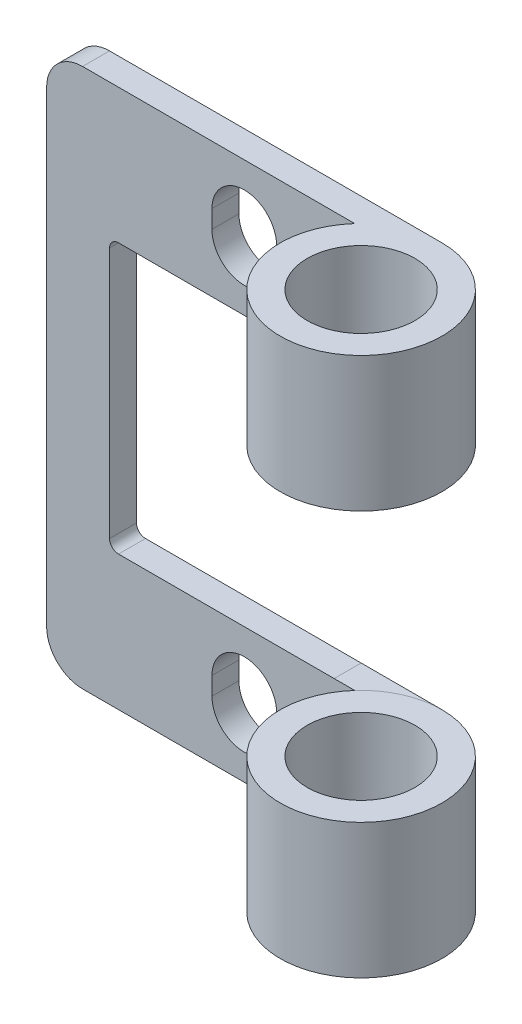
ISO-10303-21;
HEADER;
FILE_DESCRIPTION(('STEP AP214'),'2;1');
FILE_NAME('part.step','',(''),(''),'','','');
FILE_SCHEMA(('AUTOMOTIVE_DESIGN { 1 0 10303 214 1 1 1 1 }'));
ENDSEC;
DATA;
#1=APPLICATION_CONTEXT('core data for automotive mechanical design processes');
#2=APPLICATION_PROTOCOL_DEFINITION('international standard','automotive_design',2000,#1);
#3=PRODUCT_CONTEXT('',#1,'mechanical');
#4=PRODUCT('Part','Part','',(#3));
#5=PRODUCT_RELATED_PRODUCT_CATEGORY('part','',(#4));
#6=PRODUCT_DEFINITION_FORMATION('','',#4);
#7=PRODUCT_DEFINITION_CONTEXT('part definition',#1,'design');
#8=PRODUCT_DEFINITION('design','',#6,#7);
#9=PRODUCT_DEFINITION_SHAPE('','',#8);
#10=(LENGTH_UNIT() NAMED_UNIT(*) SI_UNIT(.MILLI.,.METRE.));
#11=(NAMED_UNIT(*) PLANE_ANGLE_UNIT() SI_UNIT($,.RADIAN.));
#12=(NAMED_UNIT(*) SI_UNIT($,.STERADIAN.) SOLID_ANGLE_UNIT());
#13=UNCERTAINTY_MEASURE_WITH_UNIT(LENGTH_MEASURE(1.E-05),#10,'distance_accuracy_value','');
#14=(GEOMETRIC_REPRESENTATION_CONTEXT(3) GLOBAL_UNCERTAINTY_ASSIGNED_CONTEXT((#13)) GLOBAL_UNIT_ASSIGNED_CONTEXT((#10,
#11,#12)) REPRESENTATION_CONTEXT('',''));
#15=CARTESIAN_POINT('',(0.,0.,0.));
#16=DIRECTION('',(0.,0.,1.));
#17=DIRECTION('',(1.,0.,0.));
#18=AXIS2_PLACEMENT_3D('',#15,#16,#17);
#19=CARTESIAN_POINT('',(20.5,0.,3.));
#20=DIRECTION('',(0.,-1.,0.));
#21=DIRECTION('',(0.,0.,-1.));
#22=AXIS2_PLACEMENT_3D('',#19,#20,#21);
#23=CYLINDRICAL_SURFACE('',#22,4.49999999999999);
#24=DIRECTION('',(0.,1.,0.));
#25=VECTOR('',#24,1.);
#26=CARTESIAN_POINT('',(20.5,-30.,-1.5));
#27=LINE('',#26,#25);
#28=CARTESIAN_POINT('',(20.5,-30.,-1.49999999999999));
#29=VERTEX_POINT('',#28);
#30=CARTESIAN_POINT('',(20.5,-22.5,-1.5));
#31=VERTEX_POINT('',#30);
#32=EDGE_CURVE('E321',#29,#31,#27,.T.);
#33=ORIENTED_EDGE('',*,*,#32,.T.);
#34=CARTESIAN_POINT('',(20.5,-22.5,3.));
#35=DIRECTION('',(0.,1.,0.));
#36=DIRECTION('',(0.,0.,1.));
#37=AXIS2_PLACEMENT_3D('',#34,#35,#36);
#38=CIRCLE('',#37,4.49999999999999);
#39=CARTESIAN_POINT('',(17.1458980337503,-22.5,0.));
#40=VERTEX_POINT('',#39);
#41=EDGE_CURVE('E282',#31,#40,#38,.F.);
#42=ORIENTED_EDGE('',*,*,#41,.T.);
#43=DIRECTION('',(0.,-1.,0.));
#44=VECTOR('',#43,1.);
#45=CARTESIAN_POINT('',(17.1458980337503,0.,0.));
#46=LINE('',#45,#44);
#47=CARTESIAN_POINT('',(17.1458980337503,-30.,0.));
#48=VERTEX_POINT('',#47);
#49=EDGE_CURVE('E317',#40,#48,#46,.T.);
#50=ORIENTED_EDGE('',*,*,#49,.T.);
#51=CARTESIAN_POINT('',(20.5,-30.,3.));
#52=DIRECTION('',(0.,-1.,0.));
#53=DIRECTION('',(1.,0.,0.));
#54=AXIS2_PLACEMENT_3D('',#51,#52,#53);
#55=CIRCLE('',#54,4.49999999999999);
#56=EDGE_CURVE('E306',#29,#48,#55,.T.);
#57=ORIENTED_EDGE('',*,*,#56,.F.);
#58=EDGE_LOOP('',(#33,#42,#50,#57));
#59=FACE_BOUND('',#58,.T.);
#60=ADVANCED_FACE('F43',(#59),#23,.T.);
#61=DIRECTION('',(0.,-1.,0.));
#62=VECTOR('',#61,1.);
#63=CARTESIAN_POINT('',(17.1458980337503,0.,0.));
#64=LINE('',#63,#62);
#65=CARTESIAN_POINT('',(17.1458980337503,0.,0.));
#66=VERTEX_POINT('',#65);
#67=CARTESIAN_POINT('',(17.1458980337503,-7.5,0.));
#68=VERTEX_POINT('',#67);
#69=EDGE_CURVE('E299',#66,#68,#64,.T.);
#70=ORIENTED_EDGE('',*,*,#69,.T.);
#71=CARTESIAN_POINT('',(20.5,-7.5,3.));
#72=DIRECTION('',(0.,-1.,0.));
#73=DIRECTION('',(0.,0.,-1.));
#74=AXIS2_PLACEMENT_3D('',#71,#72,#73);
#75=CIRCLE('',#74,4.49999999999999);
#76=CARTESIAN_POINT('',(20.5,-7.5,-1.5));
#77=VERTEX_POINT('',#76);
#78=EDGE_CURVE('E276',#68,#77,#75,.F.);
#79=ORIENTED_EDGE('',*,*,#78,.T.);
#80=DIRECTION('',(0.,1.,0.));
#81=VECTOR('',#80,1.);
#82=CARTESIAN_POINT('',(20.5,0.,-1.5));
#83=LINE('',#82,#81);
#84=CARTESIAN_POINT('',(20.5,0.,-1.49999999999999));
#85=VERTEX_POINT('',#84);
#86=EDGE_CURVE('E286',#77,#85,#83,.T.);
#87=ORIENTED_EDGE('',*,*,#86,.T.);
#88=CARTESIAN_POINT('',(20.5,0.,3.));
#89=DIRECTION('',(0.,-1.,0.));
#90=DIRECTION('',(1.,0.,0.));
#91=AXIS2_PLACEMENT_3D('',#88,#89,#90);
#92=CIRCLE('',#91,4.49999999999999);
#93=EDGE_CURVE('E309',#85,#66,#92,.T.);
#94=ORIENTED_EDGE('',*,*,#93,.T.);
#95=EDGE_LOOP('',(#70,#79,#87,#94));
#96=FACE_BOUND('',#95,.T.);
#97=ADVANCED_FACE('F440',(#96),#23,.T.);
#98=CARTESIAN_POINT('',(0.,0.,-1.5));
#99=DIRECTION('',(0.,0.,1.));
#100=DIRECTION('',(1.,0.,0.));
#101=AXIS2_PLACEMENT_3D('',#98,#99,#100);
#102=PLANE('',#101);
#103=DIRECTION('',(0.,-1.,0.));
#104=VECTOR('',#103,1.);
#105=CARTESIAN_POINT('',(9.20000000000001,0.,-1.5));
#106=LINE('',#105,#104);
#107=CARTESIAN_POINT('',(9.20000000000001,-25.75,-1.5));
#108=VERTEX_POINT('',#107);
#109=CARTESIAN_POINT('',(9.20000000000001,-26.75,-1.5));
#110=VERTEX_POINT('',#109);
#111=EDGE_CURVE('E260',#108,#110,#106,.T.);
#112=ORIENTED_EDGE('',*,*,#111,.T.);
#113=CARTESIAN_POINT('',(11.,-26.75,-1.5));
#114=DIRECTION('',(0.,0.,1.));
#115=DIRECTION('',(1.,0.,0.));
#116=AXIS2_PLACEMENT_3D('',#113,#114,#115);
#117=CIRCLE('',#116,1.8);
#118=CARTESIAN_POINT('',(12.8,-26.75,-1.5));
#119=VERTEX_POINT('',#118);
#120=EDGE_CURVE('E263',#110,#119,#117,.T.);
#121=ORIENTED_EDGE('',*,*,#120,.T.);
#122=DIRECTION('',(0.,1.,0.));
#123=VECTOR('',#122,1.);
#124=CARTESIAN_POINT('',(12.8,0.,-1.5));
#125=LINE('',#124,#123);
#126=CARTESIAN_POINT('',(12.8,-25.75,-1.5));
#127=VERTEX_POINT('',#126);
#128=EDGE_CURVE('E257',#119,#127,#125,.T.);
#129=ORIENTED_EDGE('',*,*,#128,.T.);
#130=CARTESIAN_POINT('',(11.,-25.75,-1.5));
#131=DIRECTION('',(0.,0.,1.));
#132=DIRECTION('',(1.,0.,0.));
#133=AXIS2_PLACEMENT_3D('',#130,#131,#132);
#134=CIRCLE('',#133,1.8);
#135=EDGE_CURVE('E198',#127,#108,#134,.T.);
#136=ORIENTED_EDGE('',*,*,#135,.T.);
#137=EDGE_LOOP('',(#112,#121,#129,#136));
#138=FACE_BOUND('',#137,.T.);
#139=DIRECTION('',(0.,1.,0.));
#140=VECTOR('',#139,1.);
#141=CARTESIAN_POINT('',(12.8,0.,-1.5));
#142=LINE('',#141,#140);
#143=CARTESIAN_POINT('',(12.8,-4.25000000000001,-1.5));
#144=VERTEX_POINT('',#143);
#145=CARTESIAN_POINT('',(12.8,-3.25000000000001,-1.5));
#146=VERTEX_POINT('',#145);
#147=EDGE_CURVE('E251',#144,#146,#142,.T.);
#148=ORIENTED_EDGE('',*,*,#147,.T.);
#149=CARTESIAN_POINT('',(11.,-3.25,-1.5));
#150=DIRECTION('',(0.,0.,1.));
#151=DIRECTION('',(1.,0.,0.));
#152=AXIS2_PLACEMENT_3D('',#149,#150,#151);
#153=CIRCLE('',#152,1.8);
#154=CARTESIAN_POINT('',(9.20000000000001,-3.25,-1.5));
#155=VERTEX_POINT('',#154);
#156=EDGE_CURVE('E254',#146,#155,#153,.T.);
#157=ORIENTED_EDGE('',*,*,#156,.T.);
#158=DIRECTION('',(0.,-1.,0.));
#159=VECTOR('',#158,1.);
#160=CARTESIAN_POINT('',(9.20000000000001,0.,-1.5));
#161=LINE('',#160,#159);
#162=CARTESIAN_POINT('',(9.20000000000001,-4.25,-1.5));
#163=VERTEX_POINT('',#162);
#164=EDGE_CURVE('E223',#155,#163,#161,.T.);
#165=ORIENTED_EDGE('',*,*,#164,.T.);
#166=CARTESIAN_POINT('',(11.,-4.25,-1.5));
#167=DIRECTION('',(0.,0.,1.));
#168=DIRECTION('',(1.,0.,0.));
#169=AXIS2_PLACEMENT_3D('',#166,#167,#168);
#170=CIRCLE('',#169,1.8);
#171=EDGE_CURVE('E248',#163,#144,#170,.T.);
#172=ORIENTED_EDGE('',*,*,#171,.T.);
#173=EDGE_LOOP('',(#148,#157,#165,#172));
#174=FACE_BOUND('',#173,.T.);
#175=DIRECTION('',(0.,-1.,0.));
#176=VECTOR('',#175,1.);
#177=CARTESIAN_POINT('',(0.,0.,-1.5));
#178=LINE('',#177,#176);
#179=CARTESIAN_POINT('',(0.,-2.,-1.5));
#180=VERTEX_POINT('',#179);
#181=CARTESIAN_POINT('',(0.,-28.,-1.5));
#182=VERTEX_POINT('',#181);
#183=EDGE_CURVE('E333',#180,#182,#178,.T.);
#184=ORIENTED_EDGE('',*,*,#183,.F.);
#185=CARTESIAN_POINT('',(2.,-2.,-1.5));
#186=DIRECTION('',(0.,0.,1.));
#187=DIRECTION('',(1.,0.,0.));
#188=AXIS2_PLACEMENT_3D('',#185,#186,#187);
#189=CIRCLE('',#188,2.);
#190=CARTESIAN_POINT('',(2.,0.,-1.5));
#191=VERTEX_POINT('',#190);
#192=EDGE_CURVE('E369',#180,#191,#189,.F.);
#193=ORIENTED_EDGE('',*,*,#192,.T.);
#194=DIRECTION('',(-1.,0.,0.));
#195=VECTOR('',#194,1.);
#196=CARTESIAN_POINT('',(0.,0.,-1.5));
#197=LINE('',#196,#195);
#198=EDGE_CURVE('E339',#85,#191,#197,.T.);
#199=ORIENTED_EDGE('',*,*,#198,.F.);
#200=ORIENTED_EDGE('',*,*,#86,.F.);
#201=DIRECTION('',(-1.,0.,0.));
#202=VECTOR('',#201,1.);
#203=CARTESIAN_POINT('',(20.5,-7.5,-1.5));
#204=LINE('',#203,#202);
#205=CARTESIAN_POINT('',(16.,-7.5,-1.5));
#206=VERTEX_POINT('',#205);
#207=EDGE_CURVE('E289',#77,#206,#204,.T.);
#208=ORIENTED_EDGE('',*,*,#207,.T.);
#209=DIRECTION('',(-1.,0.,0.));
#210=VECTOR('',#209,1.);
#211=CARTESIAN_POINT('',(3.5,-7.5,-1.5));
#212=LINE('',#211,#210);
#213=CARTESIAN_POINT('',(4.,-7.5,-1.5));
#214=VERTEX_POINT('',#213);
#215=EDGE_CURVE('E270',#206,#214,#212,.T.);
#216=ORIENTED_EDGE('',*,*,#215,.T.);
#217=CARTESIAN_POINT('',(4.,-8.,-1.5));
#218=DIRECTION('',(0.,0.,1.));
#219=DIRECTION('',(1.,0.,0.));
#220=AXIS2_PLACEMENT_3D('',#217,#218,#219);
#221=CIRCLE('',#220,0.5);
#222=CARTESIAN_POINT('',(3.5,-8.00000000000001,-1.5));
#223=VERTEX_POINT('',#222);
#224=EDGE_CURVE('E382',#214,#223,#221,.T.);
#225=ORIENTED_EDGE('',*,*,#224,.T.);
#226=DIRECTION('',(0.,-1.,0.));
#227=VECTOR('',#226,1.);
#228=CARTESIAN_POINT('',(3.5,-22.5,-1.5));
#229=LINE('',#228,#227);
#230=CARTESIAN_POINT('',(3.5,-22.,-1.5));
#231=VERTEX_POINT('',#230);
#232=EDGE_CURVE('E266',#223,#231,#229,.T.);
#233=ORIENTED_EDGE('',*,*,#232,.T.);
#234=CARTESIAN_POINT('',(4.,-22.,-1.5));
#235=DIRECTION('',(0.,0.,1.));
#236=DIRECTION('',(1.,0.,0.));
#237=AXIS2_PLACEMENT_3D('',#234,#235,#236);
#238=CIRCLE('',#237,0.5);
#239=CARTESIAN_POINT('',(4.,-22.5,-1.5));
#240=VERTEX_POINT('',#239);
#241=EDGE_CURVE('E51',#231,#240,#238,.T.);
#242=ORIENTED_EDGE('',*,*,#241,.T.);
#243=DIRECTION('',(1.,0.,0.));
#244=VECTOR('',#243,1.);
#245=CARTESIAN_POINT('',(3.5,-22.5,-1.5));
#246=LINE('',#245,#244);
#247=CARTESIAN_POINT('',(16.,-22.5,-1.5));
#248=VERTEX_POINT('',#247);
#249=EDGE_CURVE('E268',#240,#248,#246,.T.);
#250=ORIENTED_EDGE('',*,*,#249,.T.);
#251=DIRECTION('',(-1.,0.,0.));
#252=VECTOR('',#251,1.);
#253=CARTESIAN_POINT('',(20.5,-22.5,-1.5));
#254=LINE('',#253,#252);
#255=EDGE_CURVE('E329',#31,#248,#254,.T.);
#256=ORIENTED_EDGE('',*,*,#255,.F.);
#257=ORIENTED_EDGE('',*,*,#32,.F.);
#258=DIRECTION('',(1.,0.,0.));
#259=VECTOR('',#258,1.);
#260=CARTESIAN_POINT('',(0.,-30.,-1.5));
#261=LINE('',#260,#259);
#262=CARTESIAN_POINT('',(2.,-30.,-1.5));
#263=VERTEX_POINT('',#262);
#264=EDGE_CURVE('E336',#263,#29,#261,.T.);
#265=ORIENTED_EDGE('',*,*,#264,.F.);
#266=CARTESIAN_POINT('',(2.,-28.,-1.5));
#267=DIRECTION('',(0.,0.,1.));
#268=DIRECTION('',(1.,0.,0.));
#269=AXIS2_PLACEMENT_3D('',#266,#267,#268);
#270=CIRCLE('',#269,2.);
#271=EDGE_CURVE('E367',#263,#182,#270,.F.);
#272=ORIENTED_EDGE('',*,*,#271,.T.);
#273=EDGE_LOOP('',(#184,#193,#199,#200,#208,#216,#225,#233,#242,#250,#256,#257,#265,#272));
#274=FACE_BOUND('',#273,.T.);
#275=ADVANCED_FACE('F399',(#138,#174,#274),#102,.F.);
#276=CARTESIAN_POINT('',(0.,0.,0.));
#277=DIRECTION('',(0.,0.,1.));
#278=DIRECTION('',(1.,0.,0.));
#279=AXIS2_PLACEMENT_3D('',#276,#277,#278);
#280=PLANE('',#279);
#281=CARTESIAN_POINT('',(11.,-26.75,0.));
#282=DIRECTION('',(0.,0.,1.));
#283=DIRECTION('',(1.,0.,0.));
#284=AXIS2_PLACEMENT_3D('',#281,#282,#283);
#285=CIRCLE('',#284,1.8);
#286=CARTESIAN_POINT('',(9.20000000000001,-26.75,0.));
#287=VERTEX_POINT('',#286);
#288=CARTESIAN_POINT('',(12.8,-26.75,0.));
#289=VERTEX_POINT('',#288);
#290=EDGE_CURVE('E211',#287,#289,#285,.T.);
#291=ORIENTED_EDGE('',*,*,#290,.F.);
#292=DIRECTION('',(0.,-1.,0.));
#293=VECTOR('',#292,1.);
#294=CARTESIAN_POINT('',(9.20000000000001,-26.75,0.));
#295=LINE('',#294,#293);
#296=CARTESIAN_POINT('',(9.20000000000001,-25.75,0.));
#297=VERTEX_POINT('',#296);
#298=EDGE_CURVE('E216',#297,#287,#295,.T.);
#299=ORIENTED_EDGE('',*,*,#298,.F.);
#300=CARTESIAN_POINT('',(11.,-25.75,0.));
#301=DIRECTION('',(0.,0.,1.));
#302=DIRECTION('',(1.,0.,0.));
#303=AXIS2_PLACEMENT_3D('',#300,#301,#302);
#304=CIRCLE('',#303,1.8);
#305=CARTESIAN_POINT('',(12.8,-25.75,0.));
#306=VERTEX_POINT('',#305);
#307=EDGE_CURVE('E195',#306,#297,#304,.T.);
#308=ORIENTED_EDGE('',*,*,#307,.F.);
#309=DIRECTION('',(0.,1.,0.));
#310=VECTOR('',#309,1.);
#311=CARTESIAN_POINT('',(12.8,-26.75,0.));
#312=LINE('',#311,#310);
#313=EDGE_CURVE('E206',#289,#306,#312,.T.);
#314=ORIENTED_EDGE('',*,*,#313,.F.);
#315=EDGE_LOOP('',(#291,#299,#308,#314));
#316=FACE_BOUND('',#315,.T.);
#317=CARTESIAN_POINT('',(11.,-3.25,0.));
#318=DIRECTION('',(0.,0.,1.));
#319=DIRECTION('',(-1.,0.,0.));
#320=AXIS2_PLACEMENT_3D('',#317,#318,#319);
#321=CIRCLE('',#320,1.8);
#322=CARTESIAN_POINT('',(12.8,-3.25000000000001,0.));
#323=VERTEX_POINT('',#322);
#324=CARTESIAN_POINT('',(9.20000000000001,-3.25,0.));
#325=VERTEX_POINT('',#324);
#326=EDGE_CURVE('E226',#323,#325,#321,.T.);
#327=ORIENTED_EDGE('',*,*,#326,.F.);
#328=DIRECTION('',(0.,1.,0.));
#329=VECTOR('',#328,1.);
#330=CARTESIAN_POINT('',(12.8,-3.25000000000001,0.));
#331=LINE('',#330,#329);
#332=CARTESIAN_POINT('',(12.8,-4.25000000000001,0.));
#333=VERTEX_POINT('',#332);
#334=EDGE_CURVE('E234',#333,#323,#331,.T.);
#335=ORIENTED_EDGE('',*,*,#334,.F.);
#336=CARTESIAN_POINT('',(11.,-4.25,0.));
#337=DIRECTION('',(0.,0.,1.));
#338=DIRECTION('',(-1.,0.,0.));
#339=AXIS2_PLACEMENT_3D('',#336,#337,#338);
#340=CIRCLE('',#339,1.8);
#341=CARTESIAN_POINT('',(9.20000000000001,-4.25,0.));
#342=VERTEX_POINT('',#341);
#343=EDGE_CURVE('E231',#342,#333,#340,.T.);
#344=ORIENTED_EDGE('',*,*,#343,.F.);
#345=DIRECTION('',(0.,-1.,0.));
#346=VECTOR('',#345,1.);
#347=CARTESIAN_POINT('',(9.20000000000001,-3.25,0.));
#348=LINE('',#347,#346);
#349=EDGE_CURVE('E228',#325,#342,#348,.T.);
#350=ORIENTED_EDGE('',*,*,#349,.F.);
#351=EDGE_LOOP('',(#327,#335,#344,#350));
#352=FACE_BOUND('',#351,.T.);
#353=DIRECTION('',(-1.,0.,0.));
#354=VECTOR('',#353,1.);
#355=CARTESIAN_POINT('',(0.,0.,0.));
#356=LINE('',#355,#354);
#357=CARTESIAN_POINT('',(2.,0.,0.));
#358=VERTEX_POINT('',#357);
#359=EDGE_CURVE('E337',#66,#358,#356,.T.);
#360=ORIENTED_EDGE('',*,*,#359,.T.);
#361=CARTESIAN_POINT('',(2.,-2.,0.));
#362=DIRECTION('',(0.,0.,1.));
#363=DIRECTION('',(1.,0.,0.));
#364=AXIS2_PLACEMENT_3D('',#361,#362,#363);
#365=CIRCLE('',#364,2.);
#366=CARTESIAN_POINT('',(0.,-2.,0.));
#367=VERTEX_POINT('',#366);
#368=EDGE_CURVE('E360',#358,#367,#365,.T.);
#369=ORIENTED_EDGE('',*,*,#368,.T.);
#370=DIRECTION('',(0.,-1.,0.));
#371=VECTOR('',#370,1.);
#372=CARTESIAN_POINT('',(0.,0.,0.));
#373=LINE('',#372,#371);
#374=CARTESIAN_POINT('',(0.,-28.,0.));
#375=VERTEX_POINT('',#374);
#376=EDGE_CURVE('E332',#367,#375,#373,.T.);
#377=ORIENTED_EDGE('',*,*,#376,.T.);
#378=CARTESIAN_POINT('',(2.,-28.,0.));
#379=DIRECTION('',(0.,0.,1.));
#380=DIRECTION('',(1.,0.,0.));
#381=AXIS2_PLACEMENT_3D('',#378,#379,#380);
#382=CIRCLE('',#381,2.);
#383=CARTESIAN_POINT('',(2.,-30.,0.));
#384=VERTEX_POINT('',#383);
#385=EDGE_CURVE('E358',#375,#384,#382,.T.);
#386=ORIENTED_EDGE('',*,*,#385,.T.);
#387=DIRECTION('',(1.,0.,0.));
#388=VECTOR('',#387,1.);
#389=CARTESIAN_POINT('',(0.,-30.,0.));
#390=LINE('',#389,#388);
#391=EDGE_CURVE('E345',#384,#48,#390,.T.);
#392=ORIENTED_EDGE('',*,*,#391,.T.);
#393=ORIENTED_EDGE('',*,*,#49,.F.);
#394=DIRECTION('',(-1.,0.,0.));
#395=VECTOR('',#394,1.);
#396=CARTESIAN_POINT('',(20.5,-22.5,0.));
#397=LINE('',#396,#395);
#398=CARTESIAN_POINT('',(16.,-22.5,0.));
#399=VERTEX_POINT('',#398);
#400=EDGE_CURVE('E324',#40,#399,#397,.T.);
#401=ORIENTED_EDGE('',*,*,#400,.T.);
#402=DIRECTION('',(-1.,0.,0.));
#403=VECTOR('',#402,1.);
#404=CARTESIAN_POINT('',(0.,-22.5,0.));
#405=LINE('',#404,#403);
#406=CARTESIAN_POINT('',(4.,-22.5,0.));
#407=VERTEX_POINT('',#406);
#408=EDGE_CURVE('E280',#399,#407,#405,.T.);
#409=ORIENTED_EDGE('',*,*,#408,.T.);
#410=CARTESIAN_POINT('',(4.,-22.,0.));
#411=DIRECTION('',(0.,0.,1.));
#412=DIRECTION('',(1.,0.,0.));
#413=AXIS2_PLACEMENT_3D('',#410,#411,#412);
#414=CIRCLE('',#413,0.5);
#415=CARTESIAN_POINT('',(3.5,-22.,0.));
#416=VERTEX_POINT('',#415);
#417=EDGE_CURVE('E12',#407,#416,#414,.F.);
#418=ORIENTED_EDGE('',*,*,#417,.T.);
#419=DIRECTION('',(0.,1.,0.));
#420=VECTOR('',#419,1.);
#421=CARTESIAN_POINT('',(3.5,0.,0.));
#422=LINE('',#421,#420);
#423=CARTESIAN_POINT('',(3.5,-8.,0.));
#424=VERTEX_POINT('',#423);
#425=EDGE_CURVE('E342',#416,#424,#422,.T.);
#426=ORIENTED_EDGE('',*,*,#425,.T.);
#427=CARTESIAN_POINT('',(4.,-8.,0.));
#428=DIRECTION('',(0.,0.,1.));
#429=DIRECTION('',(1.,0.,0.));
#430=AXIS2_PLACEMENT_3D('',#427,#428,#429);
#431=CIRCLE('',#430,0.5);
#432=CARTESIAN_POINT('',(4.,-7.5,0.));
#433=VERTEX_POINT('',#432);
#434=EDGE_CURVE('E384',#424,#433,#431,.F.);
#435=ORIENTED_EDGE('',*,*,#434,.T.);
#436=DIRECTION('',(1.,0.,0.));
#437=VECTOR('',#436,1.);
#438=CARTESIAN_POINT('',(0.,-7.5,0.));
#439=LINE('',#438,#437);
#440=CARTESIAN_POINT('',(16.,-7.5,0.));
#441=VERTEX_POINT('',#440);
#442=EDGE_CURVE('E274',#433,#441,#439,.T.);
#443=ORIENTED_EDGE('',*,*,#442,.T.);
#444=DIRECTION('',(-1.,0.,0.));
#445=VECTOR('',#444,1.);
#446=CARTESIAN_POINT('',(20.5,-7.5,0.));
#447=LINE('',#446,#445);
#448=EDGE_CURVE('E294',#68,#441,#447,.T.);
#449=ORIENTED_EDGE('',*,*,#448,.F.);
#450=ORIENTED_EDGE('',*,*,#69,.F.);
#451=EDGE_LOOP('',(#360,#369,#377,#386,#392,#393,#401,#409,#418,#426,#435,#443,#449,#450));
#452=FACE_BOUND('',#451,.T.);
#453=ADVANCED_FACE('F213',(#316,#352,#452),#280,.T.);
#454=CARTESIAN_POINT('',(20.5,0.,3.));
#455=DIRECTION('',(0.,-1.,0.));
#456=DIRECTION('',(0.,0.,-1.));
#457=AXIS2_PLACEMENT_3D('',#454,#455,#456);
#458=CYLINDRICAL_SURFACE('',#457,2.99999999999999);
#459=CARTESIAN_POINT('',(20.5,-30.,3.));
#460=DIRECTION('',(0.,-1.,0.));
#461=DIRECTION('',(0.,0.,-1.));
#462=AXIS2_PLACEMENT_3D('',#459,#460,#461);
#463=CIRCLE('',#462,2.99999999999999);
#464=CARTESIAN_POINT('',(20.5,-30.,0.));
#465=VERTEX_POINT('',#464);
#466=EDGE_CURVE('E302',#465,#465,#463,.T.);
#467=ORIENTED_EDGE('',*,*,#466,.T.);
#468=EDGE_LOOP('',(#467));
#469=FACE_BOUND('',#468,.T.);
#470=CARTESIAN_POINT('',(20.5,-22.5,3.));
#471=DIRECTION('',(0.,1.,0.));
#472=DIRECTION('',(0.,0.,1.));
#473=AXIS2_PLACEMENT_3D('',#470,#471,#472);
#474=CIRCLE('',#473,2.99999999999999);
#475=CARTESIAN_POINT('',(20.5,-22.5,5.99999999999999));
#476=VERTEX_POINT('',#475);
#477=EDGE_CURVE('E279',#476,#476,#474,.F.);
#478=ORIENTED_EDGE('',*,*,#477,.F.);
#479=EDGE_LOOP('',(#478));
#480=FACE_BOUND('',#479,.T.);
#481=ADVANCED_FACE('F455',(#469,#480),#458,.F.);
#482=CARTESIAN_POINT('',(20.5,0.,3.));
#483=DIRECTION('',(0.,-1.,0.));
#484=DIRECTION('',(0.,0.,-1.));
#485=AXIS2_PLACEMENT_3D('',#482,#483,#484);
#486=CIRCLE('',#485,2.99999999999999);
#487=CARTESIAN_POINT('',(20.5,0.,0.));
#488=VERTEX_POINT('',#487);
#489=EDGE_CURVE('E303',#488,#488,#486,.T.);
#490=ORIENTED_EDGE('',*,*,#489,.F.);
#491=EDGE_LOOP('',(#490));
#492=FACE_BOUND('',#491,.T.);
#493=CARTESIAN_POINT('',(20.5,-7.5,3.));
#494=DIRECTION('',(0.,-1.,0.));
#495=DIRECTION('',(0.,0.,-1.));
#496=AXIS2_PLACEMENT_3D('',#493,#494,#495);
#497=CIRCLE('',#496,2.99999999999999);
#498=CARTESIAN_POINT('',(20.5,-7.5,0.));
#499=VERTEX_POINT('',#498);
#500=EDGE_CURVE('E273',#499,#499,#497,.F.);
#501=ORIENTED_EDGE('',*,*,#500,.F.);
#502=EDGE_LOOP('',(#501));
#503=FACE_BOUND('',#502,.T.);
#504=ADVANCED_FACE('F453',(#492,#503),#458,.F.);
#505=CARTESIAN_POINT('',(0.,0.,-1.5));
#506=DIRECTION('',(-1.,0.,0.));
#507=DIRECTION('',(0.,0.,1.));
#508=AXIS2_PLACEMENT_3D('',#505,#506,#507);
#509=PLANE('',#508);
#510=ORIENTED_EDGE('',*,*,#376,.F.);
#511=DIRECTION('',(0.,0.,1.));
#512=VECTOR('',#511,1.);
#513=CARTESIAN_POINT('',(0.,-2.,-1.5));
#514=LINE('',#513,#512);
#515=EDGE_CURVE('E365',#367,#180,#514,.F.);
#516=ORIENTED_EDGE('',*,*,#515,.T.);
#517=ORIENTED_EDGE('',*,*,#183,.T.);
#518=DIRECTION('',(0.,0.,1.));
#519=VECTOR('',#518,1.);
#520=CARTESIAN_POINT('',(0.,-28.,-1.5));
#521=LINE('',#520,#519);
#522=EDGE_CURVE('E362',#182,#375,#521,.T.);
#523=ORIENTED_EDGE('',*,*,#522,.T.);
#524=EDGE_LOOP('',(#510,#516,#517,#523));
#525=FACE_BOUND('',#524,.T.);
#526=ADVANCED_FACE('F427',(#525),#509,.T.);
#527=CARTESIAN_POINT('',(0.,0.,-1.5));
#528=DIRECTION('',(0.,1.,0.));
#529=DIRECTION('',(0.,0.,1.));
#530=AXIS2_PLACEMENT_3D('',#527,#528,#529);
#531=PLANE('',#530);
#532=ORIENTED_EDGE('',*,*,#198,.T.);
#533=DIRECTION('',(0.,0.,1.));
#534=VECTOR('',#533,1.);
#535=CARTESIAN_POINT('',(2.,0.,-1.5));
#536=LINE('',#535,#534);
#537=EDGE_CURVE('E355',#191,#358,#536,.T.);
#538=ORIENTED_EDGE('',*,*,#537,.T.);
#539=ORIENTED_EDGE('',*,*,#359,.F.);
#540=ORIENTED_EDGE('',*,*,#93,.F.);
#541=EDGE_LOOP('',(#532,#538,#539,#540));
#542=FACE_BOUND('',#541,.T.);
#543=ORIENTED_EDGE('',*,*,#489,.T.);
#544=EDGE_LOOP('',(#543));
#545=FACE_BOUND('',#544,.T.);
#546=ADVANCED_FACE('F435',(#542,#545),#531,.T.);
#547=CARTESIAN_POINT('',(0.,-30.,-1.5));
#548=DIRECTION('',(0.,-1.,0.));
#549=DIRECTION('',(0.,0.,-1.));
#550=AXIS2_PLACEMENT_3D('',#547,#548,#549);
#551=PLANE('',#550);
#552=ORIENTED_EDGE('',*,*,#391,.F.);
#553=DIRECTION('',(0.,0.,1.));
#554=VECTOR('',#553,1.);
#555=CARTESIAN_POINT('',(2.,-30.,-1.5));
#556=LINE('',#555,#554);
#557=EDGE_CURVE('E371',#384,#263,#556,.F.);
#558=ORIENTED_EDGE('',*,*,#557,.T.);
#559=ORIENTED_EDGE('',*,*,#264,.T.);
#560=ORIENTED_EDGE('',*,*,#56,.T.);
#561=EDGE_LOOP('',(#552,#558,#559,#560));
#562=FACE_BOUND('',#561,.T.);
#563=ORIENTED_EDGE('',*,*,#466,.F.);
#564=EDGE_LOOP('',(#563));
#565=FACE_BOUND('',#564,.T.);
#566=ADVANCED_FACE('F418',(#562,#565),#551,.T.);
#567=CARTESIAN_POINT('',(20.5,-22.5,-1.5));
#568=DIRECTION('',(0.,-1.,0.));
#569=DIRECTION('',(1.,0.,0.));
#570=AXIS2_PLACEMENT_3D('',#567,#568,#569);
#571=PLANE('',#570);
#572=ORIENTED_EDGE('',*,*,#400,.F.);
#573=CARTESIAN_POINT('',(20.5,-22.5,3.));
#574=DIRECTION('',(0.,-1.,0.));
#575=DIRECTION('',(1.,0.,0.));
#576=AXIS2_PLACEMENT_3D('',#573,#574,#575);
#577=CIRCLE('',#576,4.49999999999999);
#578=EDGE_CURVE('E312',#40,#31,#577,.T.);
#579=ORIENTED_EDGE('',*,*,#578,.T.);
#580=ORIENTED_EDGE('',*,*,#255,.T.);
#581=DIRECTION('',(0.,0.,1.));
#582=VECTOR('',#581,1.);
#583=CARTESIAN_POINT('',(16.,-22.5,-1.5));
#584=LINE('',#583,#582);
#585=EDGE_CURVE('E320',#248,#399,#584,.T.);
#586=ORIENTED_EDGE('',*,*,#585,.T.);
#587=EDGE_LOOP('',(#572,#579,#580,#586));
#588=FACE_BOUND('',#587,.T.);
#589=ADVANCED_FACE('F411',(#588),#571,.F.);
#590=CARTESIAN_POINT('',(20.5,-7.5,-1.5));
#591=DIRECTION('',(0.,1.,0.));
#592=DIRECTION('',(-1.,0.,0.));
#593=AXIS2_PLACEMENT_3D('',#590,#591,#592);
#594=PLANE('',#593);
#595=CARTESIAN_POINT('',(20.5,-7.5,3.));
#596=DIRECTION('',(0.,1.,0.));
#597=DIRECTION('',(-1.,0.,0.));
#598=AXIS2_PLACEMENT_3D('',#595,#596,#597);
#599=CIRCLE('',#598,4.49999999999999);
#600=EDGE_CURVE('E297',#68,#77,#599,.F.);
#601=ORIENTED_EDGE('',*,*,#600,.F.);
#602=ORIENTED_EDGE('',*,*,#448,.T.);
#603=DIRECTION('',(0.,0.,-1.));
#604=VECTOR('',#603,1.);
#605=CARTESIAN_POINT('',(16.,-7.5,-1.5));
#606=LINE('',#605,#604);
#607=EDGE_CURVE('E285',#441,#206,#606,.T.);
#608=ORIENTED_EDGE('',*,*,#607,.T.);
#609=ORIENTED_EDGE('',*,*,#207,.F.);
#610=EDGE_LOOP('',(#601,#602,#608,#609));
#611=FACE_BOUND('',#610,.T.);
#612=ADVANCED_FACE('F445',(#611),#594,.F.);
#613=CARTESIAN_POINT('',(3.5,-7.5,7.49999999999999));
#614=DIRECTION('',(0.,-1.,0.));
#615=DIRECTION('',(0.,0.,-1.));
#616=AXIS2_PLACEMENT_3D('',#613,#614,#615);
#617=PLANE('',#616);
#618=ORIENTED_EDGE('',*,*,#78,.F.);
#619=ORIENTED_EDGE('',*,*,#600,.T.);
#620=EDGE_LOOP('',(#618,#619));
#621=FACE_BOUND('',#620,.T.);
#622=ORIENTED_EDGE('',*,*,#500,.T.);
#623=EDGE_LOOP('',(#622));
#624=FACE_BOUND('',#623,.T.);
#625=ADVANCED_FACE('F446',(#621,#624),#617,.T.);
#626=CARTESIAN_POINT('',(3.5,-22.5,7.49999999999999));
#627=DIRECTION('',(0.,1.,0.));
#628=DIRECTION('',(0.,0.,1.));
#629=AXIS2_PLACEMENT_3D('',#626,#627,#628);
#630=PLANE('',#629);
#631=ORIENTED_EDGE('',*,*,#41,.F.);
#632=ORIENTED_EDGE('',*,*,#578,.F.);
#633=EDGE_LOOP('',(#631,#632));
#634=FACE_BOUND('',#633,.T.);
#635=ORIENTED_EDGE('',*,*,#477,.T.);
#636=EDGE_LOOP('',(#635));
#637=FACE_BOUND('',#636,.T.);
#638=ADVANCED_FACE('F449',(#634,#637),#630,.T.);
#639=ORIENTED_EDGE('',*,*,#249,.F.);
#640=DIRECTION('',(0.,0.,-1.));
#641=VECTOR('',#640,1.);
#642=CARTESIAN_POINT('',(4.,-22.5,0.));
#643=LINE('',#642,#641);
#644=EDGE_CURVE('E58',#240,#407,#643,.F.);
#645=ORIENTED_EDGE('',*,*,#644,.T.);
#646=ORIENTED_EDGE('',*,*,#408,.F.);
#647=ORIENTED_EDGE('',*,*,#585,.F.);
#648=EDGE_LOOP('',(#639,#645,#646,#647));
#649=FACE_BOUND('',#648,.T.);
#650=ADVANCED_FACE('F408',(#649),#630,.T.);
#651=ORIENTED_EDGE('',*,*,#442,.F.);
#652=DIRECTION('',(0.,0.,-1.));
#653=VECTOR('',#652,1.);
#654=CARTESIAN_POINT('',(4.,-7.5,-1.5));
#655=LINE('',#654,#653);
#656=EDGE_CURVE('E373',#433,#214,#655,.T.);
#657=ORIENTED_EDGE('',*,*,#656,.T.);
#658=ORIENTED_EDGE('',*,*,#215,.F.);
#659=ORIENTED_EDGE('',*,*,#607,.F.);
#660=EDGE_LOOP('',(#651,#657,#658,#659));
#661=FACE_BOUND('',#660,.T.);
#662=ADVANCED_FACE('F395',(#661),#617,.T.);
#663=CARTESIAN_POINT('',(3.5,-22.5,7.49999999999999));
#664=DIRECTION('',(1.,0.,0.));
#665=DIRECTION('',(0.,0.,-1.));
#666=AXIS2_PLACEMENT_3D('',#663,#664,#665);
#667=PLANE('',#666);
#668=ORIENTED_EDGE('',*,*,#232,.F.);
#669=DIRECTION('',(0.,0.,-1.));
#670=VECTOR('',#669,1.);
#671=CARTESIAN_POINT('',(3.5,-8.,0.));
#672=LINE('',#671,#670);
#673=EDGE_CURVE('E379',#223,#424,#672,.F.);
#674=ORIENTED_EDGE('',*,*,#673,.T.);
#675=ORIENTED_EDGE('',*,*,#425,.F.);
#676=DIRECTION('',(0.,0.,-1.));
#677=VECTOR('',#676,1.);
#678=CARTESIAN_POINT('',(3.5,-22.,-1.5));
#679=LINE('',#678,#677);
#680=EDGE_CURVE('E376',#416,#231,#679,.T.);
#681=ORIENTED_EDGE('',*,*,#680,.T.);
#682=EDGE_LOOP('',(#668,#674,#675,#681));
#683=FACE_BOUND('',#682,.T.);
#684=ADVANCED_FACE('F401',(#683),#667,.T.);
#685=CARTESIAN_POINT('',(2.,-2.,-1.5));
#686=DIRECTION('',(0.,0.,1.));
#687=DIRECTION('',(1.,0.,0.));
#688=AXIS2_PLACEMENT_3D('',#685,#686,#687);
#689=CYLINDRICAL_SURFACE('',#688,2.);
#690=ORIENTED_EDGE('',*,*,#192,.F.);
#691=ORIENTED_EDGE('',*,*,#515,.F.);
#692=ORIENTED_EDGE('',*,*,#368,.F.);
#693=ORIENTED_EDGE('',*,*,#537,.F.);
#694=EDGE_LOOP('',(#690,#691,#692,#693));
#695=FACE_BOUND('',#694,.T.);
#696=ADVANCED_FACE('F433',(#695),#689,.T.);
#697=CARTESIAN_POINT('',(2.,-28.,-1.5));
#698=DIRECTION('',(0.,0.,1.));
#699=DIRECTION('',(1.,0.,0.));
#700=AXIS2_PLACEMENT_3D('',#697,#698,#699);
#701=CYLINDRICAL_SURFACE('',#700,2.);
#702=ORIENTED_EDGE('',*,*,#271,.F.);
#703=ORIENTED_EDGE('',*,*,#557,.F.);
#704=ORIENTED_EDGE('',*,*,#385,.F.);
#705=ORIENTED_EDGE('',*,*,#522,.F.);
#706=EDGE_LOOP('',(#702,#703,#704,#705));
#707=FACE_BOUND('',#706,.T.);
#708=ADVANCED_FACE('F424',(#707),#701,.T.);
#709=CARTESIAN_POINT('',(11.,-3.25,-10.));
#710=DIRECTION('',(0.,0.,1.));
#711=DIRECTION('',(1.,0.,0.));
#712=AXIS2_PLACEMENT_3D('',#709,#710,#711);
#713=CYLINDRICAL_SURFACE('',#712,1.8);
#714=DIRECTION('',(0.,0.,1.));
#715=VECTOR('',#714,1.);
#716=CARTESIAN_POINT('',(12.8,-3.25000000000001,-10.));
#717=LINE('',#716,#715);
#718=EDGE_CURVE('E238',#146,#323,#717,.T.);
#719=ORIENTED_EDGE('',*,*,#718,.T.);
#720=ORIENTED_EDGE('',*,*,#326,.T.);
#721=DIRECTION('',(0.,0.,1.));
#722=VECTOR('',#721,1.);
#723=CARTESIAN_POINT('',(9.20000000000001,-3.25,-10.));
#724=LINE('',#723,#722);
#725=EDGE_CURVE('E237',#155,#325,#724,.T.);
#726=ORIENTED_EDGE('',*,*,#725,.F.);
#727=ORIENTED_EDGE('',*,*,#156,.F.);
#728=EDGE_LOOP('',(#719,#720,#726,#727));
#729=FACE_BOUND('',#728,.T.);
#730=ADVANCED_FACE('F486',(#729),#713,.F.);
#731=CARTESIAN_POINT('',(12.8,-3.25000000000001,-10.));
#732=DIRECTION('',(1.,0.,0.));
#733=DIRECTION('',(0.,0.,-1.));
#734=AXIS2_PLACEMENT_3D('',#731,#732,#733);
#735=PLANE('',#734);
#736=DIRECTION('',(0.,0.,1.));
#737=VECTOR('',#736,1.);
#738=CARTESIAN_POINT('',(12.8,-4.25000000000001,-10.));
#739=LINE('',#738,#737);
#740=EDGE_CURVE('E240',#144,#333,#739,.T.);
#741=ORIENTED_EDGE('',*,*,#740,.T.);
#742=ORIENTED_EDGE('',*,*,#334,.T.);
#743=ORIENTED_EDGE('',*,*,#718,.F.);
#744=ORIENTED_EDGE('',*,*,#147,.F.);
#745=EDGE_LOOP('',(#741,#742,#743,#744));
#746=FACE_BOUND('',#745,.T.);
#747=ADVANCED_FACE('F505',(#746),#735,.F.);
#748=CARTESIAN_POINT('',(11.,-4.25,-10.));
#749=DIRECTION('',(0.,0.,1.));
#750=DIRECTION('',(1.,0.,0.));
#751=AXIS2_PLACEMENT_3D('',#748,#749,#750);
#752=CYLINDRICAL_SURFACE('',#751,1.8);
#753=DIRECTION('',(0.,0.,1.));
#754=VECTOR('',#753,1.);
#755=CARTESIAN_POINT('',(9.20000000000001,-4.25,-10.));
#756=LINE('',#755,#754);
#757=EDGE_CURVE('E242',#163,#342,#756,.T.);
#758=ORIENTED_EDGE('',*,*,#757,.T.);
#759=ORIENTED_EDGE('',*,*,#343,.T.);
#760=ORIENTED_EDGE('',*,*,#740,.F.);
#761=ORIENTED_EDGE('',*,*,#171,.F.);
#762=EDGE_LOOP('',(#758,#759,#760,#761));
#763=FACE_BOUND('',#762,.T.);
#764=ADVANCED_FACE('F508',(#763),#752,.F.);
#765=CARTESIAN_POINT('',(9.20000000000001,-3.25,-10.));
#766=DIRECTION('',(-1.,0.,0.));
#767=DIRECTION('',(0.,0.,1.));
#768=AXIS2_PLACEMENT_3D('',#765,#766,#767);
#769=PLANE('',#768);
#770=ORIENTED_EDGE('',*,*,#725,.T.);
#771=ORIENTED_EDGE('',*,*,#349,.T.);
#772=ORIENTED_EDGE('',*,*,#757,.F.);
#773=ORIENTED_EDGE('',*,*,#164,.F.);
#774=EDGE_LOOP('',(#770,#771,#772,#773));
#775=FACE_BOUND('',#774,.T.);
#776=ADVANCED_FACE('F503',(#775),#769,.F.);
#777=CARTESIAN_POINT('',(11.,-26.75,-10.));
#778=DIRECTION('',(0.,0.,1.));
#779=DIRECTION('',(1.,0.,0.));
#780=AXIS2_PLACEMENT_3D('',#777,#778,#779);
#781=CYLINDRICAL_SURFACE('',#780,1.8);
#782=DIRECTION('',(0.,0.,1.));
#783=VECTOR('',#782,1.);
#784=CARTESIAN_POINT('',(9.20000000000001,-26.75,-10.));
#785=LINE('',#784,#783);
#786=EDGE_CURVE('E221',#110,#287,#785,.T.);
#787=ORIENTED_EDGE('',*,*,#786,.T.);
#788=ORIENTED_EDGE('',*,*,#290,.T.);
#789=DIRECTION('',(0.,0.,1.));
#790=VECTOR('',#789,1.);
#791=CARTESIAN_POINT('',(12.8,-26.75,-10.));
#792=LINE('',#791,#790);
#793=EDGE_CURVE('E202',#119,#289,#792,.T.);
#794=ORIENTED_EDGE('',*,*,#793,.F.);
#795=ORIENTED_EDGE('',*,*,#120,.F.);
#796=EDGE_LOOP('',(#787,#788,#794,#795));
#797=FACE_BOUND('',#796,.T.);
#798=ADVANCED_FACE('F500',(#797),#781,.F.);
#799=CARTESIAN_POINT('',(9.20000000000001,-26.75,-10.));
#800=DIRECTION('',(-1.,0.,0.));
#801=DIRECTION('',(0.,0.,1.));
#802=AXIS2_PLACEMENT_3D('',#799,#800,#801);
#803=PLANE('',#802);
#804=DIRECTION('',(0.,0.,1.));
#805=VECTOR('',#804,1.);
#806=CARTESIAN_POINT('',(9.20000000000001,-25.75,-10.));
#807=LINE('',#806,#805);
#808=EDGE_CURVE('E201',#108,#297,#807,.T.);
#809=ORIENTED_EDGE('',*,*,#808,.T.);
#810=ORIENTED_EDGE('',*,*,#298,.T.);
#811=ORIENTED_EDGE('',*,*,#786,.F.);
#812=ORIENTED_EDGE('',*,*,#111,.F.);
#813=EDGE_LOOP('',(#809,#810,#811,#812));
#814=FACE_BOUND('',#813,.T.);
#815=ADVANCED_FACE('F496',(#814),#803,.F.);
#816=CARTESIAN_POINT('',(11.,-25.75,-10.));
#817=DIRECTION('',(0.,0.,1.));
#818=DIRECTION('',(1.,0.,0.));
#819=AXIS2_PLACEMENT_3D('',#816,#817,#818);
#820=CYLINDRICAL_SURFACE('',#819,1.8);
#821=DIRECTION('',(0.,0.,1.));
#822=VECTOR('',#821,1.);
#823=CARTESIAN_POINT('',(12.8,-25.75,-10.));
#824=LINE('',#823,#822);
#825=EDGE_CURVE('E190',#127,#306,#824,.T.);
#826=ORIENTED_EDGE('',*,*,#825,.T.);
#827=ORIENTED_EDGE('',*,*,#307,.T.);
#828=ORIENTED_EDGE('',*,*,#808,.F.);
#829=ORIENTED_EDGE('',*,*,#135,.F.);
#830=EDGE_LOOP('',(#826,#827,#828,#829));
#831=FACE_BOUND('',#830,.T.);
#832=ADVANCED_FACE('F192',(#831),#820,.F.);
#833=CARTESIAN_POINT('',(12.8,-26.75,-10.));
#834=DIRECTION('',(1.,0.,0.));
#835=DIRECTION('',(0.,0.,-1.));
#836=AXIS2_PLACEMENT_3D('',#833,#834,#835);
#837=PLANE('',#836);
#838=ORIENTED_EDGE('',*,*,#793,.T.);
#839=ORIENTED_EDGE('',*,*,#313,.T.);
#840=ORIENTED_EDGE('',*,*,#825,.F.);
#841=ORIENTED_EDGE('',*,*,#128,.F.);
#842=EDGE_LOOP('',(#838,#839,#840,#841));
#843=FACE_BOUND('',#842,.T.);
#844=ADVANCED_FACE('F207',(#843),#837,.F.);
#845=CARTESIAN_POINT('',(4.,-8.,7.49999999999999));
#846=DIRECTION('',(0.,0.,1.));
#847=DIRECTION('',(1.,0.,0.));
#848=AXIS2_PLACEMENT_3D('',#845,#846,#847);
#849=CYLINDRICAL_SURFACE('',#848,0.5);
#850=ORIENTED_EDGE('',*,*,#434,.F.);
#851=ORIENTED_EDGE('',*,*,#673,.F.);
#852=ORIENTED_EDGE('',*,*,#224,.F.);
#853=ORIENTED_EDGE('',*,*,#656,.F.);
#854=EDGE_LOOP('',(#850,#851,#852,#853));
#855=FACE_BOUND('',#854,.T.);
#856=ADVANCED_FACE('F396',(#855),#849,.F.);
#857=CARTESIAN_POINT('',(4.,-22.,7.49999999999999));
#858=DIRECTION('',(0.,0.,1.));
#859=DIRECTION('',(1.,0.,0.));
#860=AXIS2_PLACEMENT_3D('',#857,#858,#859);
#861=CYLINDRICAL_SURFACE('',#860,0.5);
#862=ORIENTED_EDGE('',*,*,#417,.F.);
#863=ORIENTED_EDGE('',*,*,#644,.F.);
#864=ORIENTED_EDGE('',*,*,#241,.F.);
#865=ORIENTED_EDGE('',*,*,#680,.F.);
#866=EDGE_LOOP('',(#862,#863,#864,#865));
#867=FACE_BOUND('',#866,.T.);
#868=ADVANCED_FACE('F45',(#867),#861,.F.);
#869=CLOSED_SHELL('',(#60,#97,#275,#453,#481,#504,#526,#546,#566,#589,#612,#625,#638,#650,#662,
#684,#696,#708,#730,#747,#764,#776,#798,#815,#832,#844,#856,#868));
#870=MANIFOLD_SOLID_BREP('B2',#869);
#871=ADVANCED_BREP_SHAPE_REPRESENTATION('',(#18,#870),#14);
#872=SHAPE_DEFINITION_REPRESENTATION(#9,#871);
ENDSEC;
END-ISO-10303-21;
